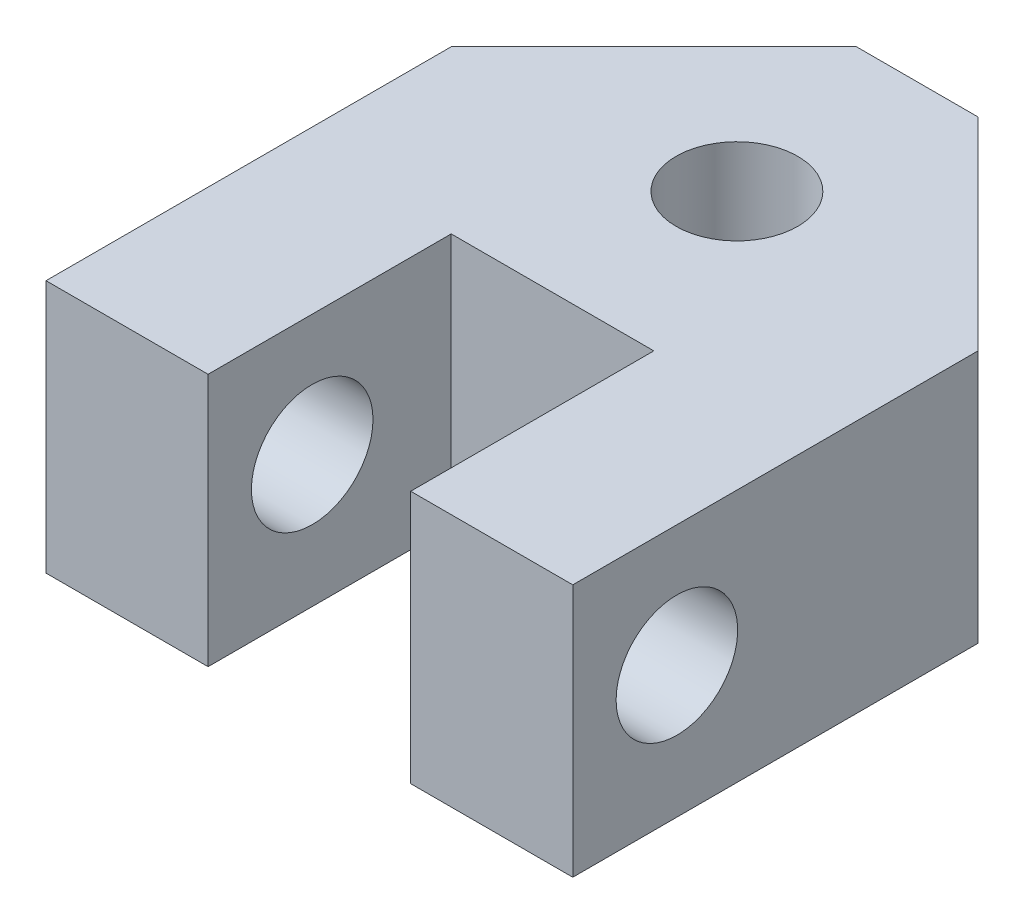
ISO-10303-21;
HEADER;
FILE_DESCRIPTION(('STEP AP214'),'2;1');
FILE_NAME('part.step','',(''),(''),'','','');
FILE_SCHEMA(('AUTOMOTIVE_DESIGN { 1 0 10303 214 1 1 1 1 }'));
ENDSEC;
DATA;
#1=APPLICATION_CONTEXT('core data for automotive mechanical design processes');
#2=APPLICATION_PROTOCOL_DEFINITION('international standard','automotive_design',2000,#1);
#3=PRODUCT_CONTEXT('',#1,'mechanical');
#4=PRODUCT('Part','Part','',(#3));
#5=PRODUCT_RELATED_PRODUCT_CATEGORY('part','',(#4));
#6=PRODUCT_DEFINITION_FORMATION('','',#4);
#7=PRODUCT_DEFINITION_CONTEXT('part definition',#1,'design');
#8=PRODUCT_DEFINITION('design','',#6,#7);
#9=PRODUCT_DEFINITION_SHAPE('','',#8);
#10=(LENGTH_UNIT() NAMED_UNIT(*) SI_UNIT(.MILLI.,.METRE.));
#11=(NAMED_UNIT(*) PLANE_ANGLE_UNIT() SI_UNIT($,.RADIAN.));
#12=(NAMED_UNIT(*) SI_UNIT($,.STERADIAN.) SOLID_ANGLE_UNIT());
#13=UNCERTAINTY_MEASURE_WITH_UNIT(LENGTH_MEASURE(1.E-05),#10,'distance_accuracy_value','');
#14=(GEOMETRIC_REPRESENTATION_CONTEXT(3) GLOBAL_UNCERTAINTY_ASSIGNED_CONTEXT((#13)) GLOBAL_UNIT_ASSIGNED_CONTEXT((#10,
#11,#12)) REPRESENTATION_CONTEXT('',''));
#15=CARTESIAN_POINT('',(0.,0.,0.));
#16=DIRECTION('',(0.,0.,1.));
#17=DIRECTION('',(1.,0.,0.));
#18=AXIS2_PLACEMENT_3D('',#15,#16,#17);
#19=CARTESIAN_POINT('',(15.,-7.5,20.));
#20=DIRECTION('',(0.,0.,1.));
#21=DIRECTION('',(1.,0.,0.));
#22=AXIS2_PLACEMENT_3D('',#19,#20,#21);
#23=PLANE('',#22);
#24=DIRECTION('',(-1.,0.,0.));
#25=VECTOR('',#24,1.);
#26=CARTESIAN_POINT('',(15.,-6.5,20.));
#27=LINE('',#26,#25);
#28=CARTESIAN_POINT('',(13.,-6.5,20.));
#29=VERTEX_POINT('',#28);
#30=CARTESIAN_POINT('',(5.,-6.5,20.));
#31=VERTEX_POINT('',#30);
#32=EDGE_CURVE('E114',#29,#31,#27,.T.);
#33=ORIENTED_EDGE('',*,*,#32,.F.);
#34=DIRECTION('',(0.,-1.,0.));
#35=VECTOR('',#34,1.);
#36=CARTESIAN_POINT('',(13.,-7.5,20.));
#37=LINE('',#36,#35);
#38=CARTESIAN_POINT('',(13.,6.,20.));
#39=VERTEX_POINT('',#38);
#40=EDGE_CURVE('E125',#39,#29,#37,.T.);
#41=ORIENTED_EDGE('',*,*,#40,.F.);
#42=DIRECTION('',(-1.,0.,0.));
#43=VECTOR('',#42,1.);
#44=CARTESIAN_POINT('',(-15.,6.,20.));
#45=LINE('',#44,#43);
#46=CARTESIAN_POINT('',(5.,6.,20.));
#47=VERTEX_POINT('',#46);
#48=EDGE_CURVE('E172',#39,#47,#45,.T.);
#49=ORIENTED_EDGE('',*,*,#48,.T.);
#50=DIRECTION('',(0.,1.,0.));
#51=VECTOR('',#50,1.);
#52=CARTESIAN_POINT('',(5.,-7.5,20.));
#53=LINE('',#52,#51);
#54=EDGE_CURVE('E119',#31,#47,#53,.T.);
#55=ORIENTED_EDGE('',*,*,#54,.F.);
#56=EDGE_LOOP('',(#33,#41,#49,#55));
#57=FACE_BOUND('',#56,.T.);
#58=ADVANCED_FACE('F33',(#57),#23,.T.);
#59=CARTESIAN_POINT('',(-15.,6.,20.));
#60=DIRECTION('',(0.,-1.,0.));
#61=DIRECTION('',(0.,0.,-1.));
#62=AXIS2_PLACEMENT_3D('',#59,#60,#61);
#63=PLANE('',#62);
#64=CARTESIAN_POINT('',(0.231400022130722,6.,-0.869933178962582));
#65=DIRECTION('',(0.,1.,0.));
#66=DIRECTION('',(0.,0.,1.));
#67=AXIS2_PLACEMENT_3D('',#64,#65,#66);
#68=CIRCLE('',#67,3.00000000000002);
#69=CARTESIAN_POINT('',(0.231400022130722,6.,2.13006682103744));
#70=VERTEX_POINT('',#69);
#71=EDGE_CURVE('E146',#70,#70,#68,.T.);
#72=ORIENTED_EDGE('',*,*,#71,.F.);
#73=EDGE_LOOP('',(#72));
#74=FACE_BOUND('',#73,.T.);
#75=DIRECTION('',(0.,0.,1.));
#76=VECTOR('',#75,1.);
#77=CARTESIAN_POINT('',(13.,6.,-13.3998616387441));
#78=LINE('',#77,#76);
#79=CARTESIAN_POINT('',(13.,6.,0.));
#80=VERTEX_POINT('',#79);
#81=EDGE_CURVE('E132',#80,#39,#78,.T.);
#82=ORIENTED_EDGE('',*,*,#81,.F.);
#83=DIRECTION('',(0.707106781186546,0.,0.707106781186549));
#84=VECTOR('',#83,1.);
#85=CARTESIAN_POINT('',(2.99999999999999,6.,-10.));
#86=LINE('',#85,#84);
#87=CARTESIAN_POINT('',(2.99999999999999,6.,-10.));
#88=VERTEX_POINT('',#87);
#89=EDGE_CURVE('E41',#80,#88,#86,.F.);
#90=ORIENTED_EDGE('',*,*,#89,.T.);
#91=DIRECTION('',(1.,0.,0.));
#92=VECTOR('',#91,1.);
#93=CARTESIAN_POINT('',(-15.,6.,-10.));
#94=LINE('',#93,#92);
#95=CARTESIAN_POINT('',(-2.99999999999999,6.,-10.));
#96=VERTEX_POINT('',#95);
#97=EDGE_CURVE('E149',#96,#88,#94,.T.);
#98=ORIENTED_EDGE('',*,*,#97,.F.);
#99=DIRECTION('',(0.707106781186546,0.,-0.707106781186549));
#100=VECTOR('',#99,1.);
#101=CARTESIAN_POINT('',(-2.99999999999999,6.,-10.));
#102=LINE('',#101,#100);
#103=CARTESIAN_POINT('',(-13.,6.,0.));
#104=VERTEX_POINT('',#103);
#105=EDGE_CURVE('E48',#96,#104,#102,.F.);
#106=ORIENTED_EDGE('',*,*,#105,.T.);
#107=DIRECTION('',(0.,0.,-1.));
#108=VECTOR('',#107,1.);
#109=CARTESIAN_POINT('',(-13.,6.,-13.3998616387441));
#110=LINE('',#109,#108);
#111=CARTESIAN_POINT('',(-13.,6.,20.));
#112=VERTEX_POINT('',#111);
#113=EDGE_CURVE('E133',#112,#104,#110,.T.);
#114=ORIENTED_EDGE('',*,*,#113,.F.);
#115=CARTESIAN_POINT('',(-5.00000000000001,6.,20.));
#116=VERTEX_POINT('',#115);
#117=EDGE_CURVE('E169',#116,#112,#45,.T.);
#118=ORIENTED_EDGE('',*,*,#117,.F.);
#119=DIRECTION('',(0.,0.,-1.));
#120=VECTOR('',#119,1.);
#121=CARTESIAN_POINT('',(-5.00000000000001,6.,28.1632423609155));
#122=LINE('',#121,#120);
#123=CARTESIAN_POINT('',(-5.00000000000002,6.,8.));
#124=VERTEX_POINT('',#123);
#125=EDGE_CURVE('E159',#116,#124,#122,.T.);
#126=ORIENTED_EDGE('',*,*,#125,.T.);
#127=DIRECTION('',(1.,0.,0.));
#128=VECTOR('',#127,1.);
#129=CARTESIAN_POINT('',(-5.00000000000002,6.,8.));
#130=LINE('',#129,#128);
#131=CARTESIAN_POINT('',(5.,6.,8.));
#132=VERTEX_POINT('',#131);
#133=EDGE_CURVE('E162',#124,#132,#130,.T.);
#134=ORIENTED_EDGE('',*,*,#133,.T.);
#135=DIRECTION('',(0.,0.,1.));
#136=VECTOR('',#135,1.);
#137=CARTESIAN_POINT('',(5.,6.,28.1632423609155));
#138=LINE('',#137,#136);
#139=EDGE_CURVE('E156',#132,#47,#138,.T.);
#140=ORIENTED_EDGE('',*,*,#139,.T.);
#141=ORIENTED_EDGE('',*,*,#48,.F.);
#142=EDGE_LOOP('',(#82,#90,#98,#106,#114,#118,#126,#134,#140,#141));
#143=FACE_BOUND('',#142,.T.);
#144=ADVANCED_FACE('F190',(#74,#143),#63,.F.);
#145=DIRECTION('',(-1.,0.,0.));
#146=VECTOR('',#145,1.);
#147=CARTESIAN_POINT('',(15.,-6.5,20.));
#148=LINE('',#147,#146);
#149=CARTESIAN_POINT('',(-5.00000000000001,-6.5,20.));
#150=VERTEX_POINT('',#149);
#151=CARTESIAN_POINT('',(-13.,-6.5,20.));
#152=VERTEX_POINT('',#151);
#153=EDGE_CURVE('E228',#150,#152,#148,.T.);
#154=ORIENTED_EDGE('',*,*,#153,.F.);
#155=DIRECTION('',(0.,-1.,0.));
#156=VECTOR('',#155,1.);
#157=CARTESIAN_POINT('',(-5.00000000000002,-7.5,20.));
#158=LINE('',#157,#156);
#159=EDGE_CURVE('E174',#116,#150,#158,.T.);
#160=ORIENTED_EDGE('',*,*,#159,.F.);
#161=ORIENTED_EDGE('',*,*,#117,.T.);
#162=DIRECTION('',(0.,1.,0.));
#163=VECTOR('',#162,1.);
#164=CARTESIAN_POINT('',(-13.,-7.5,20.));
#165=LINE('',#164,#163);
#166=EDGE_CURVE('E144',#152,#112,#165,.T.);
#167=ORIENTED_EDGE('',*,*,#166,.F.);
#168=EDGE_LOOP('',(#154,#160,#161,#167));
#169=FACE_BOUND('',#168,.T.);
#170=ADVANCED_FACE('F209',(#169),#23,.T.);
#171=CARTESIAN_POINT('',(5.,6.,28.1632423609155));
#172=DIRECTION('',(1.,0.,0.));
#173=DIRECTION('',(0.,0.,-1.));
#174=AXIS2_PLACEMENT_3D('',#171,#172,#173);
#175=PLANE('',#174);
#176=CARTESIAN_POINT('',(5.,0.,14.861357689432));
#177=DIRECTION('',(1.,0.,0.));
#178=DIRECTION('',(0.,0.,-1.));
#179=AXIS2_PLACEMENT_3D('',#176,#177,#178);
#180=CIRCLE('',#179,3.);
#181=CARTESIAN_POINT('',(5.,0.,11.861357689432));
#182=VERTEX_POINT('',#181);
#183=EDGE_CURVE('E153',#182,#182,#180,.T.);
#184=ORIENTED_EDGE('',*,*,#183,.T.);
#185=EDGE_LOOP('',(#184));
#186=FACE_BOUND('',#185,.T.);
#187=DIRECTION('',(0.,-1.,0.));
#188=VECTOR('',#187,1.);
#189=CARTESIAN_POINT('',(5.,6.,8.));
#190=LINE('',#189,#188);
#191=CARTESIAN_POINT('',(5.,-6.5,8.00000000000001));
#192=VERTEX_POINT('',#191);
#193=EDGE_CURVE('E166',#132,#192,#190,.T.);
#194=ORIENTED_EDGE('',*,*,#193,.T.);
#195=DIRECTION('',(0.,0.,1.));
#196=VECTOR('',#195,1.);
#197=CARTESIAN_POINT('',(5.,-6.5,28.1632423609155));
#198=LINE('',#197,#196);
#199=EDGE_CURVE('E233',#192,#31,#198,.T.);
#200=ORIENTED_EDGE('',*,*,#199,.T.);
#201=ORIENTED_EDGE('',*,*,#54,.T.);
#202=ORIENTED_EDGE('',*,*,#139,.F.);
#203=EDGE_LOOP('',(#194,#200,#201,#202));
#204=FACE_BOUND('',#203,.T.);
#205=ADVANCED_FACE('F217',(#186,#204),#175,.F.);
#206=CARTESIAN_POINT('',(-5.00000000000002,6.,8.));
#207=DIRECTION('',(0.,0.,-1.));
#208=DIRECTION('',(-1.,0.,0.));
#209=AXIS2_PLACEMENT_3D('',#206,#207,#208);
#210=PLANE('',#209);
#211=DIRECTION('',(0.,-1.,0.));
#212=VECTOR('',#211,1.);
#213=CARTESIAN_POINT('',(-5.00000000000002,6.,8.));
#214=LINE('',#213,#212);
#215=CARTESIAN_POINT('',(-5.00000000000002,-6.5,8.));
#216=VERTEX_POINT('',#215);
#217=EDGE_CURVE('E165',#124,#216,#214,.T.);
#218=ORIENTED_EDGE('',*,*,#217,.T.);
#219=DIRECTION('',(1.,0.,0.));
#220=VECTOR('',#219,1.);
#221=CARTESIAN_POINT('',(-5.00000000000002,-6.5,8.));
#222=LINE('',#221,#220);
#223=EDGE_CURVE('E249',#216,#192,#222,.T.);
#224=ORIENTED_EDGE('',*,*,#223,.T.);
#225=ORIENTED_EDGE('',*,*,#193,.F.);
#226=ORIENTED_EDGE('',*,*,#133,.F.);
#227=EDGE_LOOP('',(#218,#224,#225,#226));
#228=FACE_BOUND('',#227,.T.);
#229=ADVANCED_FACE('F222',(#228),#210,.F.);
#230=CARTESIAN_POINT('',(-5.00000000000001,6.,28.1632423609155));
#231=DIRECTION('',(-1.,0.,0.));
#232=DIRECTION('',(0.,0.,1.));
#233=AXIS2_PLACEMENT_3D('',#230,#231,#232);
#234=PLANE('',#233);
#235=CARTESIAN_POINT('',(-5.00000000000002,0.,14.861357689432));
#236=DIRECTION('',(-1.,0.,0.));
#237=DIRECTION('',(0.,0.,1.));
#238=AXIS2_PLACEMENT_3D('',#235,#236,#237);
#239=CIRCLE('',#238,3.);
#240=CARTESIAN_POINT('',(-5.00000000000001,0.,17.861357689432));
#241=VERTEX_POINT('',#240);
#242=EDGE_CURVE('E152',#241,#241,#239,.T.);
#243=ORIENTED_EDGE('',*,*,#242,.T.);
#244=EDGE_LOOP('',(#243));
#245=FACE_BOUND('',#244,.T.);
#246=ORIENTED_EDGE('',*,*,#159,.T.);
#247=DIRECTION('',(0.,0.,-1.));
#248=VECTOR('',#247,1.);
#249=CARTESIAN_POINT('',(-5.00000000000001,-6.5,28.1632423609155));
#250=LINE('',#249,#248);
#251=EDGE_CURVE('E232',#150,#216,#250,.T.);
#252=ORIENTED_EDGE('',*,*,#251,.T.);
#253=ORIENTED_EDGE('',*,*,#217,.F.);
#254=ORIENTED_EDGE('',*,*,#125,.F.);
#255=EDGE_LOOP('',(#246,#252,#253,#254));
#256=FACE_BOUND('',#255,.T.);
#257=ADVANCED_FACE('F237',(#245,#256),#234,.F.);
#258=CARTESIAN_POINT('',(-15.,0.,14.861357689432));
#259=DIRECTION('',(1.,0.,0.));
#260=DIRECTION('',(0.,1.,0.));
#261=AXIS2_PLACEMENT_3D('',#258,#259,#260);
#262=CYLINDRICAL_SURFACE('',#261,3.);
#263=CARTESIAN_POINT('',(-13.,0.,14.861357689432));
#264=DIRECTION('',(1.,0.,0.));
#265=DIRECTION('',(0.,0.,-1.));
#266=AXIS2_PLACEMENT_3D('',#263,#264,#265);
#267=CIRCLE('',#266,3.);
#268=CARTESIAN_POINT('',(-13.,0.,11.861357689432));
#269=VERTEX_POINT('',#268);
#270=EDGE_CURVE('E136',#269,#269,#267,.F.);
#271=ORIENTED_EDGE('',*,*,#270,.T.);
#272=EDGE_LOOP('',(#271));
#273=FACE_BOUND('',#272,.T.);
#274=ORIENTED_EDGE('',*,*,#242,.F.);
#275=EDGE_LOOP('',(#274));
#276=FACE_BOUND('',#275,.T.);
#277=ADVANCED_FACE('F274',(#273,#276),#262,.F.);
#278=CARTESIAN_POINT('',(13.,0.,14.861357689432));
#279=DIRECTION('',(-1.,0.,0.));
#280=DIRECTION('',(0.,0.,1.));
#281=AXIS2_PLACEMENT_3D('',#278,#279,#280);
#282=CIRCLE('',#281,3.);
#283=CARTESIAN_POINT('',(13.,0.,17.861357689432));
#284=VERTEX_POINT('',#283);
#285=EDGE_CURVE('E134',#284,#284,#282,.F.);
#286=ORIENTED_EDGE('',*,*,#285,.T.);
#287=EDGE_LOOP('',(#286));
#288=FACE_BOUND('',#287,.T.);
#289=ORIENTED_EDGE('',*,*,#183,.F.);
#290=EDGE_LOOP('',(#289));
#291=FACE_BOUND('',#290,.T.);
#292=ADVANCED_FACE('F268',(#288,#291),#262,.F.);
#293=CARTESIAN_POINT('',(15.,-7.5,-10.));
#294=DIRECTION('',(0.,0.,1.));
#295=DIRECTION('',(1.,0.,0.));
#296=AXIS2_PLACEMENT_3D('',#293,#294,#295);
#297=PLANE('',#296);
#298=ORIENTED_EDGE('',*,*,#97,.T.);
#299=DIRECTION('',(0.,-1.,0.));
#300=VECTOR('',#299,1.);
#301=CARTESIAN_POINT('',(2.99999999999999,-7.5,-10.));
#302=LINE('',#301,#300);
#303=CARTESIAN_POINT('',(3.,-6.5,-10.));
#304=VERTEX_POINT('',#303);
#305=EDGE_CURVE('E182',#88,#304,#302,.T.);
#306=ORIENTED_EDGE('',*,*,#305,.T.);
#307=DIRECTION('',(-1.,0.,0.));
#308=VECTOR('',#307,1.);
#309=CARTESIAN_POINT('',(15.,-6.5,-10.));
#310=LINE('',#309,#308);
#311=CARTESIAN_POINT('',(-2.99999999999998,-6.5,-10.));
#312=VERTEX_POINT('',#311);
#313=EDGE_CURVE('E128',#304,#312,#310,.T.);
#314=ORIENTED_EDGE('',*,*,#313,.T.);
#315=DIRECTION('',(0.,1.,0.));
#316=VECTOR('',#315,1.);
#317=CARTESIAN_POINT('',(-2.99999999999999,-7.5,-10.));
#318=LINE('',#317,#316);
#319=EDGE_CURVE('E118',#312,#96,#318,.T.);
#320=ORIENTED_EDGE('',*,*,#319,.T.);
#321=EDGE_LOOP('',(#298,#306,#314,#320));
#322=FACE_BOUND('',#321,.T.);
#323=ADVANCED_FACE('F194',(#322),#297,.F.);
#324=CARTESIAN_POINT('',(0.231400022130722,-7.5,-0.869933178962582));
#325=DIRECTION('',(0.,1.,0.));
#326=DIRECTION('',(0.,0.,1.));
#327=AXIS2_PLACEMENT_3D('',#324,#325,#326);
#328=CYLINDRICAL_SURFACE('',#327,3.00000000000002);
#329=CARTESIAN_POINT('',(0.231400022130722,-6.5,-0.869933178962582));
#330=DIRECTION('',(0.,1.,0.));
#331=DIRECTION('',(0.,0.,1.));
#332=AXIS2_PLACEMENT_3D('',#329,#330,#331);
#333=CIRCLE('',#332,3.00000000000002);
#334=CARTESIAN_POINT('',(0.231400022130722,-6.5,2.13006682103744));
#335=VERTEX_POINT('',#334);
#336=EDGE_CURVE('E252',#335,#335,#333,.F.);
#337=ORIENTED_EDGE('',*,*,#336,.T.);
#338=EDGE_LOOP('',(#337));
#339=FACE_BOUND('',#338,.T.);
#340=ORIENTED_EDGE('',*,*,#71,.T.);
#341=EDGE_LOOP('',(#340));
#342=FACE_BOUND('',#341,.T.);
#343=ADVANCED_FACE('F256',(#339,#342),#328,.F.);
#344=CARTESIAN_POINT('',(-13.,-7.5,-13.3998616387441));
#345=DIRECTION('',(1.,0.,0.));
#346=DIRECTION('',(0.,0.,-1.));
#347=AXIS2_PLACEMENT_3D('',#344,#345,#346);
#348=PLANE('',#347);
#349=ORIENTED_EDGE('',*,*,#113,.T.);
#350=DIRECTION('',(0.,-1.,0.));
#351=VECTOR('',#350,1.);
#352=CARTESIAN_POINT('',(-13.,-7.5,0.));
#353=LINE('',#352,#351);
#354=CARTESIAN_POINT('',(-13.,-6.5,0.));
#355=VERTEX_POINT('',#354);
#356=EDGE_CURVE('E11',#104,#355,#353,.T.);
#357=ORIENTED_EDGE('',*,*,#356,.T.);
#358=DIRECTION('',(0.,0.,1.));
#359=VECTOR('',#358,1.);
#360=CARTESIAN_POINT('',(-13.,-6.5,-13.3998616387441));
#361=LINE('',#360,#359);
#362=EDGE_CURVE('E127',#355,#152,#361,.T.);
#363=ORIENTED_EDGE('',*,*,#362,.T.);
#364=ORIENTED_EDGE('',*,*,#166,.T.);
#365=EDGE_LOOP('',(#349,#357,#363,#364));
#366=FACE_BOUND('',#365,.T.);
#367=ORIENTED_EDGE('',*,*,#270,.F.);
#368=EDGE_LOOP('',(#367));
#369=FACE_BOUND('',#368,.T.);
#370=ADVANCED_FACE('F241',(#366,#369),#348,.F.);
#371=CARTESIAN_POINT('',(13.,-7.5,-13.3998616387441));
#372=DIRECTION('',(-1.,0.,0.));
#373=DIRECTION('',(0.,0.,1.));
#374=AXIS2_PLACEMENT_3D('',#371,#372,#373);
#375=PLANE('',#374);
#376=DIRECTION('',(0.,0.,-1.));
#377=VECTOR('',#376,1.);
#378=CARTESIAN_POINT('',(13.,-6.5,-13.3998616387441));
#379=LINE('',#378,#377);
#380=CARTESIAN_POINT('',(13.,-6.5,0.));
#381=VERTEX_POINT('',#380);
#382=EDGE_CURVE('E109',#29,#381,#379,.T.);
#383=ORIENTED_EDGE('',*,*,#382,.T.);
#384=DIRECTION('',(0.,1.,0.));
#385=VECTOR('',#384,1.);
#386=CARTESIAN_POINT('',(13.,-7.5,0.));
#387=LINE('',#386,#385);
#388=EDGE_CURVE('E56',#381,#80,#387,.T.);
#389=ORIENTED_EDGE('',*,*,#388,.T.);
#390=ORIENTED_EDGE('',*,*,#81,.T.);
#391=ORIENTED_EDGE('',*,*,#40,.T.);
#392=EDGE_LOOP('',(#383,#389,#390,#391));
#393=FACE_BOUND('',#392,.T.);
#394=ORIENTED_EDGE('',*,*,#285,.F.);
#395=EDGE_LOOP('',(#394));
#396=FACE_BOUND('',#395,.T.);
#397=ADVANCED_FACE('F130',(#393,#396),#375,.F.);
#398=CARTESIAN_POINT('',(42.5138300589651,-6.5,-22.8093348455047));
#399=DIRECTION('',(0.,1.,0.));
#400=DIRECTION('',(0.,0.,1.));
#401=AXIS2_PLACEMENT_3D('',#398,#399,#400);
#402=PLANE('',#401);
#403=ORIENTED_EDGE('',*,*,#313,.F.);
#404=DIRECTION('',(-0.707106781186546,0.,-0.707106781186549));
#405=VECTOR('',#404,1.);
#406=CARTESIAN_POINT('',(2.99999999999999,-6.5,-10.));
#407=LINE('',#406,#405);
#408=EDGE_CURVE('E116',#304,#381,#407,.F.);
#409=ORIENTED_EDGE('',*,*,#408,.T.);
#410=ORIENTED_EDGE('',*,*,#382,.F.);
#411=ORIENTED_EDGE('',*,*,#32,.T.);
#412=ORIENTED_EDGE('',*,*,#199,.F.);
#413=ORIENTED_EDGE('',*,*,#223,.F.);
#414=ORIENTED_EDGE('',*,*,#251,.F.);
#415=ORIENTED_EDGE('',*,*,#153,.T.);
#416=ORIENTED_EDGE('',*,*,#362,.F.);
#417=DIRECTION('',(-0.707106781186546,0.,0.707106781186549));
#418=VECTOR('',#417,1.);
#419=CARTESIAN_POINT('',(-2.99999999999999,-6.5,-10.));
#420=LINE('',#419,#418);
#421=EDGE_CURVE('E185',#355,#312,#420,.F.);
#422=ORIENTED_EDGE('',*,*,#421,.T.);
#423=EDGE_LOOP('',(#403,#409,#410,#411,#412,#413,#414,#415,#416,#422));
#424=FACE_BOUND('',#423,.T.);
#425=ORIENTED_EDGE('',*,*,#336,.F.);
#426=EDGE_LOOP('',(#425));
#427=FACE_BOUND('',#426,.T.);
#428=ADVANCED_FACE('F112',(#424,#427),#402,.F.);
#429=CARTESIAN_POINT('',(2.99999999999999,-7.5,-10.));
#430=DIRECTION('',(-0.707106781186549,0.,0.707106781186546));
#431=DIRECTION('',(0.,-1.,0.));
#432=AXIS2_PLACEMENT_3D('',#429,#430,#431);
#433=PLANE('',#432);
#434=ORIENTED_EDGE('',*,*,#89,.F.);
#435=ORIENTED_EDGE('',*,*,#388,.F.);
#436=ORIENTED_EDGE('',*,*,#408,.F.);
#437=ORIENTED_EDGE('',*,*,#305,.F.);
#438=EDGE_LOOP('',(#434,#435,#436,#437));
#439=FACE_BOUND('',#438,.T.);
#440=ADVANCED_FACE('F197',(#439),#433,.F.);
#441=CARTESIAN_POINT('',(-2.99999999999999,-7.5,-10.));
#442=DIRECTION('',(0.707106781186549,0.,0.707106781186546));
#443=DIRECTION('',(0.,1.,0.));
#444=AXIS2_PLACEMENT_3D('',#441,#442,#443);
#445=PLANE('',#444);
#446=ORIENTED_EDGE('',*,*,#421,.F.);
#447=ORIENTED_EDGE('',*,*,#356,.F.);
#448=ORIENTED_EDGE('',*,*,#105,.F.);
#449=ORIENTED_EDGE('',*,*,#319,.F.);
#450=EDGE_LOOP('',(#446,#447,#448,#449));
#451=FACE_BOUND('',#450,.T.);
#452=ADVANCED_FACE('F35',(#451),#445,.F.);
#453=CLOSED_SHELL('',(#58,#144,#170,#205,#229,#257,#277,#292,#323,#343,#370,#397,#428,#440,#452));
#454=MANIFOLD_SOLID_BREP('B2',#453);
#455=ADVANCED_BREP_SHAPE_REPRESENTATION('',(#18,#454),#14);
#456=SHAPE_DEFINITION_REPRESENTATION(#9,#455);
ENDSEC;
END-ISO-10303-21;
